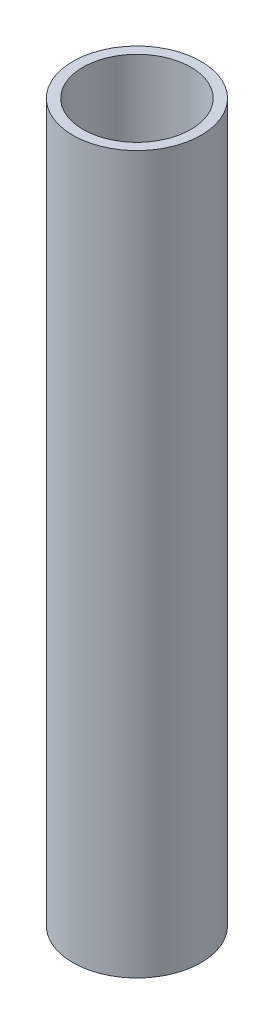
ISO-10303-21;
HEADER;
FILE_DESCRIPTION(('STEP AP214'),'2;1');
FILE_NAME('part.step','',(''),(''),'','','');
FILE_SCHEMA(('AUTOMOTIVE_DESIGN { 1 0 10303 214 1 1 1 1 }'));
ENDSEC;
DATA;
#1=APPLICATION_CONTEXT('core data for automotive mechanical design processes');
#2=APPLICATION_PROTOCOL_DEFINITION('international standard','automotive_design',2000,#1);
#3=PRODUCT_CONTEXT('',#1,'mechanical');
#4=PRODUCT('Part','Part','',(#3));
#5=PRODUCT_RELATED_PRODUCT_CATEGORY('part','',(#4));
#6=PRODUCT_DEFINITION_FORMATION('','',#4);
#7=PRODUCT_DEFINITION_CONTEXT('part definition',#1,'design');
#8=PRODUCT_DEFINITION('design','',#6,#7);
#9=PRODUCT_DEFINITION_SHAPE('','',#8);
#10=(LENGTH_UNIT() NAMED_UNIT(*) SI_UNIT(.MILLI.,.METRE.));
#11=(NAMED_UNIT(*) PLANE_ANGLE_UNIT() SI_UNIT($,.RADIAN.));
#12=(NAMED_UNIT(*) SI_UNIT($,.STERADIAN.) SOLID_ANGLE_UNIT());
#13=UNCERTAINTY_MEASURE_WITH_UNIT(LENGTH_MEASURE(1.E-05),#10,'distance_accuracy_value','');
#14=(GEOMETRIC_REPRESENTATION_CONTEXT(3) GLOBAL_UNCERTAINTY_ASSIGNED_CONTEXT((#13)) GLOBAL_UNIT_ASSIGNED_CONTEXT((#10,
#11,#12)) REPRESENTATION_CONTEXT('',''));
#15=CARTESIAN_POINT('',(0.,0.,0.));
#16=DIRECTION('',(0.,0.,1.));
#17=DIRECTION('',(1.,0.,0.));
#18=AXIS2_PLACEMENT_3D('',#15,#16,#17);
#19=CARTESIAN_POINT('',(0.,168.656,0.));
#20=DIRECTION('',(0.,1.,0.));
#21=DIRECTION('',(0.,0.,1.));
#22=AXIS2_PLACEMENT_3D('',#19,#20,#21);
#23=PLANE('',#22);
#24=CARTESIAN_POINT('',(0.,168.656,0.));
#25=DIRECTION('',(0.,1.,0.));
#26=DIRECTION('',(0.,0.,1.));
#27=AXIS2_PLACEMENT_3D('',#24,#25,#26);
#28=CIRCLE('',#27,30.1625);
#29=CARTESIAN_POINT('',(0.,168.656,30.1625));
#30=VERTEX_POINT('',#29);
#31=EDGE_CURVE('E10',#30,#30,#28,.T.);
#32=ORIENTED_EDGE('',*,*,#31,.T.);
#33=EDGE_LOOP('',(#32));
#34=FACE_BOUND('',#33,.T.);
#35=CARTESIAN_POINT('',(0.,168.656,0.));
#36=DIRECTION('',(0.,1.,0.));
#37=DIRECTION('',(0.,0.,1.));
#38=AXIS2_PLACEMENT_3D('',#35,#36,#37);
#39=CIRCLE('',#38,25.4);
#40=CARTESIAN_POINT('',(0.,168.656,25.4));
#41=VERTEX_POINT('',#40);
#42=EDGE_CURVE('E46',#41,#41,#39,.T.);
#43=ORIENTED_EDGE('',*,*,#42,.F.);
#44=EDGE_LOOP('',(#43));
#45=FACE_BOUND('',#44,.T.);
#46=ADVANCED_FACE('F35',(#34,#45),#23,.T.);
#47=CARTESIAN_POINT('',(0.,-168.656,0.));
#48=DIRECTION('',(0.,1.,0.));
#49=DIRECTION('',(0.,0.,1.));
#50=AXIS2_PLACEMENT_3D('',#47,#48,#49);
#51=PLANE('',#50);
#52=CARTESIAN_POINT('',(0.,-168.656,0.));
#53=DIRECTION('',(0.,1.,0.));
#54=DIRECTION('',(0.,0.,1.));
#55=AXIS2_PLACEMENT_3D('',#52,#53,#54);
#56=CIRCLE('',#55,30.1625);
#57=CARTESIAN_POINT('',(0.,-168.656,30.1625));
#58=VERTEX_POINT('',#57);
#59=EDGE_CURVE('E39',#58,#58,#56,.T.);
#60=ORIENTED_EDGE('',*,*,#59,.F.);
#61=EDGE_LOOP('',(#60));
#62=FACE_BOUND('',#61,.T.);
#63=CARTESIAN_POINT('',(0.,-168.656,0.));
#64=DIRECTION('',(0.,1.,0.));
#65=DIRECTION('',(0.,0.,1.));
#66=AXIS2_PLACEMENT_3D('',#63,#64,#65);
#67=CIRCLE('',#66,25.4);
#68=CARTESIAN_POINT('',(0.,-168.656,25.4));
#69=VERTEX_POINT('',#68);
#70=EDGE_CURVE('E48',#69,#69,#67,.T.);
#71=ORIENTED_EDGE('',*,*,#70,.T.);
#72=EDGE_LOOP('',(#71));
#73=FACE_BOUND('',#72,.T.);
#74=ADVANCED_FACE('F58',(#62,#73),#51,.F.);
#75=CARTESIAN_POINT('',(0.,168.656,0.));
#76=DIRECTION('',(0.,-1.,0.));
#77=DIRECTION('',(0.,0.,-1.));
#78=AXIS2_PLACEMENT_3D('',#75,#76,#77);
#79=CYLINDRICAL_SURFACE('',#78,30.1625);
#80=ORIENTED_EDGE('',*,*,#31,.F.);
#81=EDGE_LOOP('',(#80));
#82=FACE_BOUND('',#81,.T.);
#83=ORIENTED_EDGE('',*,*,#59,.T.);
#84=EDGE_LOOP('',(#83));
#85=FACE_BOUND('',#84,.T.);
#86=ADVANCED_FACE('F37',(#82,#85),#79,.T.);
#87=CARTESIAN_POINT('',(0.,168.656,0.));
#88=DIRECTION('',(0.,-1.,0.));
#89=DIRECTION('',(0.,0.,-1.));
#90=AXIS2_PLACEMENT_3D('',#87,#88,#89);
#91=CYLINDRICAL_SURFACE('',#90,25.4);
#92=ORIENTED_EDGE('',*,*,#42,.T.);
#93=EDGE_LOOP('',(#92));
#94=FACE_BOUND('',#93,.T.);
#95=ORIENTED_EDGE('',*,*,#70,.F.);
#96=EDGE_LOOP('',(#95));
#97=FACE_BOUND('',#96,.T.);
#98=ADVANCED_FACE('F54',(#94,#97),#91,.F.);
#99=CLOSED_SHELL('',(#46,#74,#86,#98));
#100=MANIFOLD_SOLID_BREP('B2',#99);
#101=ADVANCED_BREP_SHAPE_REPRESENTATION('',(#18,#100),#14);
#102=SHAPE_DEFINITION_REPRESENTATION(#9,#101);
ENDSEC;
END-ISO-10303-21;
